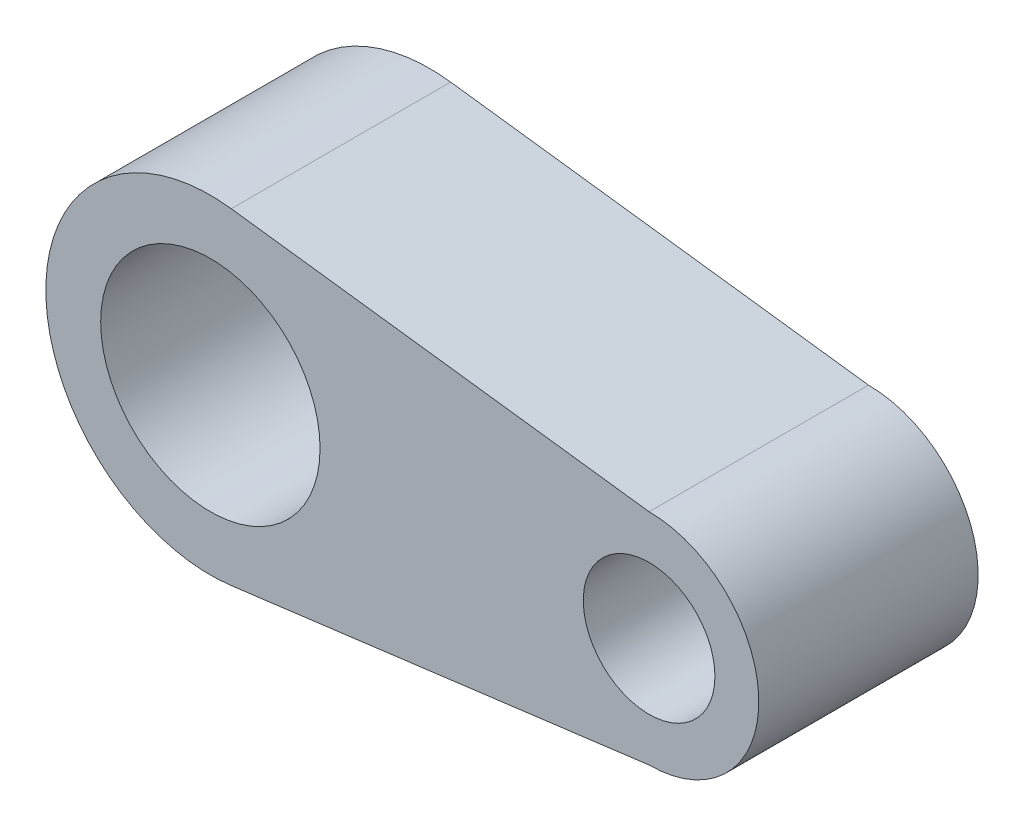
ISO-10303-21;
HEADER;
FILE_DESCRIPTION(('STEP AP214'),'2;1');
FILE_NAME('part.step','',(''),(''),'','','');
FILE_SCHEMA(('AUTOMOTIVE_DESIGN { 1 0 10303 214 1 1 1 1 }'));
ENDSEC;
DATA;
#1=APPLICATION_CONTEXT('core data for automotive mechanical design processes');
#2=APPLICATION_PROTOCOL_DEFINITION('international standard','automotive_design',2000,#1);
#3=PRODUCT_CONTEXT('',#1,'mechanical');
#4=PRODUCT('Part','Part','',(#3));
#5=PRODUCT_RELATED_PRODUCT_CATEGORY('part','',(#4));
#6=PRODUCT_DEFINITION_FORMATION('','',#4);
#7=PRODUCT_DEFINITION_CONTEXT('part definition',#1,'design');
#8=PRODUCT_DEFINITION('design','',#6,#7);
#9=PRODUCT_DEFINITION_SHAPE('','',#8);
#10=(LENGTH_UNIT() NAMED_UNIT(*) SI_UNIT(.MILLI.,.METRE.));
#11=(NAMED_UNIT(*) PLANE_ANGLE_UNIT() SI_UNIT($,.RADIAN.));
#12=(NAMED_UNIT(*) SI_UNIT($,.STERADIAN.) SOLID_ANGLE_UNIT());
#13=UNCERTAINTY_MEASURE_WITH_UNIT(LENGTH_MEASURE(1.E-05),#10,'distance_accuracy_value','');
#14=(GEOMETRIC_REPRESENTATION_CONTEXT(3) GLOBAL_UNCERTAINTY_ASSIGNED_CONTEXT((#13)) GLOBAL_UNIT_ASSIGNED_CONTEXT((#10,
#11,#12)) REPRESENTATION_CONTEXT('',''));
#15=CARTESIAN_POINT('',(0.,0.,0.));
#16=DIRECTION('',(0.,0.,1.));
#17=DIRECTION('',(1.,0.,0.));
#18=AXIS2_PLACEMENT_3D('',#15,#16,#17);
#19=CARTESIAN_POINT('',(0.952688437970163,-7.43924624811937,10.));
#20=DIRECTION('',(0.127025125062688,-0.991899499749248,0.));
#21=DIRECTION('',(0.991899499749248,0.127025125062688,0.));
#22=AXIS2_PLACEMENT_3D('',#19,#20,#21);
#23=PLANE('',#22);
#24=DIRECTION('',(-0.991899499749248,-0.127025125062688,0.));
#25=VECTOR('',#24,1.);
#26=CARTESIAN_POINT('',(0.952688437970163,-7.43924624811937,0.));
#27=LINE('',#26,#25);
#28=CARTESIAN_POINT('',(20.,-5.,0.));
#29=VERTEX_POINT('',#28);
#30=CARTESIAN_POINT('',(0.952688437970161,-7.43924624811936,0.));
#31=VERTEX_POINT('',#30);
#32=EDGE_CURVE('E107',#29,#31,#27,.T.);
#33=ORIENTED_EDGE('',*,*,#32,.F.);
#34=DIRECTION('',(0.,0.,-1.));
#35=VECTOR('',#34,1.);
#36=CARTESIAN_POINT('',(20.,-5.,10.));
#37=LINE('',#36,#35);
#38=CARTESIAN_POINT('',(20.,-5.,10.));
#39=VERTEX_POINT('',#38);
#40=EDGE_CURVE('E11',#39,#29,#37,.T.);
#41=ORIENTED_EDGE('',*,*,#40,.F.);
#42=DIRECTION('',(-0.991899499749248,-0.127025125062688,0.));
#43=VECTOR('',#42,1.);
#44=CARTESIAN_POINT('',(0.952688437970163,-7.43924624811937,10.));
#45=LINE('',#44,#43);
#46=CARTESIAN_POINT('',(0.952688437970161,-7.43924624811936,10.));
#47=VERTEX_POINT('',#46);
#48=EDGE_CURVE('E89',#39,#47,#45,.T.);
#49=ORIENTED_EDGE('',*,*,#48,.T.);
#50=DIRECTION('',(0.,0.,-1.));
#51=VECTOR('',#50,1.);
#52=CARTESIAN_POINT('',(0.952688437970161,-7.43924624811936,10.));
#53=LINE('',#52,#51);
#54=EDGE_CURVE('E77',#47,#31,#53,.T.);
#55=ORIENTED_EDGE('',*,*,#54,.T.);
#56=EDGE_LOOP('',(#33,#41,#49,#55));
#57=FACE_BOUND('',#56,.T.);
#58=ADVANCED_FACE('F38',(#57),#23,.T.);
#59=CARTESIAN_POINT('',(20.,0.,10.));
#60=DIRECTION('',(0.,0.,-1.));
#61=DIRECTION('',(-1.,0.,0.));
#62=AXIS2_PLACEMENT_3D('',#59,#60,#61);
#63=CYLINDRICAL_SURFACE('',#62,5.);
#64=CARTESIAN_POINT('',(20.,0.,0.));
#65=DIRECTION('',(0.,0.,1.));
#66=DIRECTION('',(1.,0.,0.));
#67=AXIS2_PLACEMENT_3D('',#64,#65,#66);
#68=CIRCLE('',#67,5.);
#69=CARTESIAN_POINT('',(20.,5.,0.));
#70=VERTEX_POINT('',#69);
#71=EDGE_CURVE('E94',#29,#70,#68,.T.);
#72=ORIENTED_EDGE('',*,*,#71,.T.);
#73=DIRECTION('',(0.,0.,-1.));
#74=VECTOR('',#73,1.);
#75=CARTESIAN_POINT('',(20.,5.,10.));
#76=LINE('',#75,#74);
#77=CARTESIAN_POINT('',(20.,5.,10.));
#78=VERTEX_POINT('',#77);
#79=EDGE_CURVE('E46',#78,#70,#76,.T.);
#80=ORIENTED_EDGE('',*,*,#79,.F.);
#81=CARTESIAN_POINT('',(20.,0.,10.));
#82=DIRECTION('',(0.,0.,1.));
#83=DIRECTION('',(1.,0.,0.));
#84=AXIS2_PLACEMENT_3D('',#81,#82,#83);
#85=CIRCLE('',#84,5.);
#86=EDGE_CURVE('E83',#39,#78,#85,.T.);
#87=ORIENTED_EDGE('',*,*,#86,.F.);
#88=ORIENTED_EDGE('',*,*,#40,.T.);
#89=EDGE_LOOP('',(#72,#80,#87,#88));
#90=FACE_BOUND('',#89,.T.);
#91=ADVANCED_FACE('F92',(#90),#63,.T.);
#92=CARTESIAN_POINT('',(0.952688437970159,7.43924624811936,10.));
#93=DIRECTION('',(-0.127025125062688,-0.991899499749248,0.));
#94=DIRECTION('',(0.991899499749248,-0.127025125062688,0.));
#95=AXIS2_PLACEMENT_3D('',#92,#93,#94);
#96=PLANE('',#95);
#97=DIRECTION('',(-0.991899499749248,0.127025125062688,0.));
#98=VECTOR('',#97,1.);
#99=CARTESIAN_POINT('',(0.952688437970159,7.43924624811936,0.));
#100=LINE('',#99,#98);
#101=CARTESIAN_POINT('',(0.952688437970159,7.43924624811936,0.));
#102=VERTEX_POINT('',#101);
#103=EDGE_CURVE('E70',#70,#102,#100,.T.);
#104=ORIENTED_EDGE('',*,*,#103,.T.);
#105=DIRECTION('',(0.,0.,-1.));
#106=VECTOR('',#105,1.);
#107=CARTESIAN_POINT('',(0.952688437970159,7.43924624811936,10.));
#108=LINE('',#107,#106);
#109=CARTESIAN_POINT('',(0.952688437970159,7.43924624811936,10.));
#110=VERTEX_POINT('',#109);
#111=EDGE_CURVE('E95',#110,#102,#108,.T.);
#112=ORIENTED_EDGE('',*,*,#111,.F.);
#113=DIRECTION('',(-0.991899499749248,0.127025125062688,0.));
#114=VECTOR('',#113,1.);
#115=CARTESIAN_POINT('',(0.952688437970159,7.43924624811936,10.));
#116=LINE('',#115,#114);
#117=EDGE_CURVE('E88',#78,#110,#116,.T.);
#118=ORIENTED_EDGE('',*,*,#117,.F.);
#119=ORIENTED_EDGE('',*,*,#79,.T.);
#120=EDGE_LOOP('',(#104,#112,#118,#119));
#121=FACE_BOUND('',#120,.T.);
#122=ADVANCED_FACE('F96',(#121),#96,.F.);
#123=CARTESIAN_POINT('',(0.,0.,10.));
#124=DIRECTION('',(0.,0.,-1.));
#125=DIRECTION('',(-1.,0.,0.));
#126=AXIS2_PLACEMENT_3D('',#123,#124,#125);
#127=CYLINDRICAL_SURFACE('',#126,5.);
#128=CARTESIAN_POINT('',(0.,0.,10.));
#129=DIRECTION('',(0.,0.,1.));
#130=DIRECTION('',(1.,0.,0.));
#131=AXIS2_PLACEMENT_3D('',#128,#129,#130);
#132=CIRCLE('',#131,5.);
#133=CARTESIAN_POINT('',(5.,0.,10.));
#134=VERTEX_POINT('',#133);
#135=EDGE_CURVE('E98',#134,#134,#132,.T.);
#136=ORIENTED_EDGE('',*,*,#135,.T.);
#137=EDGE_LOOP('',(#136));
#138=FACE_BOUND('',#137,.T.);
#139=CARTESIAN_POINT('',(0.,0.,0.));
#140=DIRECTION('',(0.,0.,1.));
#141=DIRECTION('',(1.,0.,0.));
#142=AXIS2_PLACEMENT_3D('',#139,#140,#141);
#143=CIRCLE('',#142,5.);
#144=CARTESIAN_POINT('',(5.,0.,0.));
#145=VERTEX_POINT('',#144);
#146=EDGE_CURVE('E114',#145,#145,#143,.T.);
#147=ORIENTED_EDGE('',*,*,#146,.F.);
#148=EDGE_LOOP('',(#147));
#149=FACE_BOUND('',#148,.T.);
#150=ADVANCED_FACE('F134',(#138,#149),#127,.F.);
#151=CARTESIAN_POINT('',(0.,0.,10.));
#152=DIRECTION('',(0.,0.,-1.));
#153=DIRECTION('',(-1.,0.,0.));
#154=AXIS2_PLACEMENT_3D('',#151,#152,#153);
#155=CYLINDRICAL_SURFACE('',#154,7.5);
#156=CARTESIAN_POINT('',(0.,0.,0.));
#157=DIRECTION('',(0.,0.,1.));
#158=DIRECTION('',(1.,0.,0.));
#159=AXIS2_PLACEMENT_3D('',#156,#157,#158);
#160=CIRCLE('',#159,7.5);
#161=EDGE_CURVE('E112',#102,#31,#160,.T.);
#162=ORIENTED_EDGE('',*,*,#161,.T.);
#163=ORIENTED_EDGE('',*,*,#54,.F.);
#164=CARTESIAN_POINT('',(0.,0.,10.));
#165=DIRECTION('',(0.,0.,1.));
#166=DIRECTION('',(1.,0.,0.));
#167=AXIS2_PLACEMENT_3D('',#164,#165,#166);
#168=CIRCLE('',#167,7.5);
#169=EDGE_CURVE('E54',#110,#47,#168,.T.);
#170=ORIENTED_EDGE('',*,*,#169,.F.);
#171=ORIENTED_EDGE('',*,*,#111,.T.);
#172=EDGE_LOOP('',(#162,#163,#170,#171));
#173=FACE_BOUND('',#172,.T.);
#174=ADVANCED_FACE('F123',(#173),#155,.T.);
#175=CARTESIAN_POINT('',(20.,0.,10.));
#176=DIRECTION('',(0.,0.,-1.));
#177=DIRECTION('',(-1.,0.,0.));
#178=AXIS2_PLACEMENT_3D('',#175,#176,#177);
#179=CYLINDRICAL_SURFACE('',#178,3.);
#180=CARTESIAN_POINT('',(20.,0.,10.));
#181=DIRECTION('',(0.,0.,1.));
#182=DIRECTION('',(1.,0.,0.));
#183=AXIS2_PLACEMENT_3D('',#180,#181,#182);
#184=CIRCLE('',#183,3.);
#185=CARTESIAN_POINT('',(23.,0.,10.));
#186=VERTEX_POINT('',#185);
#187=EDGE_CURVE('E104',#186,#186,#184,.T.);
#188=ORIENTED_EDGE('',*,*,#187,.T.);
#189=EDGE_LOOP('',(#188));
#190=FACE_BOUND('',#189,.T.);
#191=CARTESIAN_POINT('',(20.,0.,0.));
#192=DIRECTION('',(0.,0.,1.));
#193=DIRECTION('',(1.,0.,0.));
#194=AXIS2_PLACEMENT_3D('',#191,#192,#193);
#195=CIRCLE('',#194,3.);
#196=CARTESIAN_POINT('',(23.,0.,0.));
#197=VERTEX_POINT('',#196);
#198=EDGE_CURVE('E117',#197,#197,#195,.T.);
#199=ORIENTED_EDGE('',*,*,#198,.F.);
#200=EDGE_LOOP('',(#199));
#201=FACE_BOUND('',#200,.T.);
#202=ADVANCED_FACE('F139',(#190,#201),#179,.F.);
#203=CARTESIAN_POINT('',(0.,0.,10.));
#204=DIRECTION('',(0.,0.,1.));
#205=DIRECTION('',(1.,0.,0.));
#206=AXIS2_PLACEMENT_3D('',#203,#204,#205);
#207=PLANE('',#206);
#208=ORIENTED_EDGE('',*,*,#48,.F.);
#209=ORIENTED_EDGE('',*,*,#86,.T.);
#210=ORIENTED_EDGE('',*,*,#117,.T.);
#211=ORIENTED_EDGE('',*,*,#169,.T.);
#212=EDGE_LOOP('',(#208,#209,#210,#211));
#213=FACE_BOUND('',#212,.T.);
#214=ORIENTED_EDGE('',*,*,#135,.F.);
#215=EDGE_LOOP('',(#214));
#216=FACE_BOUND('',#215,.T.);
#217=ORIENTED_EDGE('',*,*,#187,.F.);
#218=EDGE_LOOP('',(#217));
#219=FACE_BOUND('',#218,.T.);
#220=ADVANCED_FACE('F85',(#213,#216,#219),#207,.T.);
#221=CARTESIAN_POINT('',(0.,0.,0.));
#222=DIRECTION('',(0.,0.,1.));
#223=DIRECTION('',(1.,0.,0.));
#224=AXIS2_PLACEMENT_3D('',#221,#222,#223);
#225=PLANE('',#224);
#226=ORIENTED_EDGE('',*,*,#32,.T.);
#227=ORIENTED_EDGE('',*,*,#161,.F.);
#228=ORIENTED_EDGE('',*,*,#103,.F.);
#229=ORIENTED_EDGE('',*,*,#71,.F.);
#230=EDGE_LOOP('',(#226,#227,#228,#229));
#231=FACE_BOUND('',#230,.T.);
#232=ORIENTED_EDGE('',*,*,#146,.T.);
#233=EDGE_LOOP('',(#232));
#234=FACE_BOUND('',#233,.T.);
#235=ORIENTED_EDGE('',*,*,#198,.T.);
#236=EDGE_LOOP('',(#235));
#237=FACE_BOUND('',#236,.T.);
#238=ADVANCED_FACE('F125',(#231,#234,#237),#225,.F.);
#239=CLOSED_SHELL('',(#58,#91,#122,#150,#174,#202,#220,#238));
#240=MANIFOLD_SOLID_BREP('B2',#239);
#241=ADVANCED_BREP_SHAPE_REPRESENTATION('',(#18,#240),#14);
#242=SHAPE_DEFINITION_REPRESENTATION(#9,#241);
ENDSEC;
END-ISO-10303-21;
